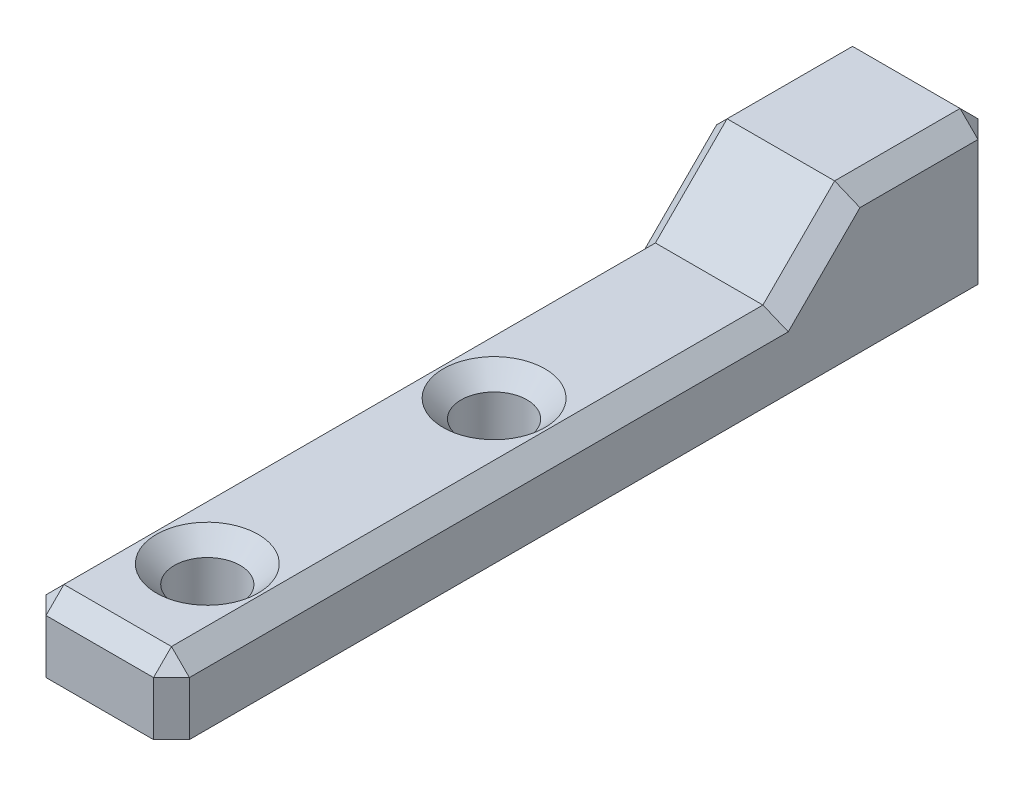
ISO-10303-21;
HEADER;
FILE_DESCRIPTION(('STEP AP214'),'2;1');
FILE_NAME('part.step','',(''),(''),'','','');
FILE_SCHEMA(('AUTOMOTIVE_DESIGN { 1 0 10303 214 1 1 1 1 }'));
ENDSEC;
DATA;
#1=APPLICATION_CONTEXT('core data for automotive mechanical design processes');
#2=APPLICATION_PROTOCOL_DEFINITION('international standard','automotive_design',2000,#1);
#3=PRODUCT_CONTEXT('',#1,'mechanical');
#4=PRODUCT('Part','Part','',(#3));
#5=PRODUCT_RELATED_PRODUCT_CATEGORY('part','',(#4));
#6=PRODUCT_DEFINITION_FORMATION('','',#4);
#7=PRODUCT_DEFINITION_CONTEXT('part definition',#1,'design');
#8=PRODUCT_DEFINITION('design','',#6,#7);
#9=PRODUCT_DEFINITION_SHAPE('','',#8);
#10=(LENGTH_UNIT() NAMED_UNIT(*) SI_UNIT(.MILLI.,.METRE.));
#11=(NAMED_UNIT(*) PLANE_ANGLE_UNIT() SI_UNIT($,.RADIAN.));
#12=(NAMED_UNIT(*) SI_UNIT($,.STERADIAN.) SOLID_ANGLE_UNIT());
#13=UNCERTAINTY_MEASURE_WITH_UNIT(LENGTH_MEASURE(1.E-05),#10,'distance_accuracy_value','');
#14=(GEOMETRIC_REPRESENTATION_CONTEXT(3) GLOBAL_UNCERTAINTY_ASSIGNED_CONTEXT((#13)) GLOBAL_UNIT_ASSIGNED_CONTEXT((#10,
#11,#12)) REPRESENTATION_CONTEXT('',''));
#15=CARTESIAN_POINT('',(0.,0.,0.));
#16=DIRECTION('',(0.,0.,1.));
#17=DIRECTION('',(1.,0.,0.));
#18=AXIS2_PLACEMENT_3D('',#15,#16,#17);
#19=CARTESIAN_POINT('',(0.,12.7,0.));
#20=DIRECTION('',(0.,-1.,0.));
#21=DIRECTION('',(0.,0.,-1.));
#22=AXIS2_PLACEMENT_3D('',#19,#20,#21);
#23=PLANE('',#22);
#24=DIRECTION('',(-1.,0.,0.));
#25=VECTOR('',#24,1.);
#26=CARTESIAN_POINT('',(0.,12.7,-71.4375));
#27=LINE('',#26,#25);
#28=CARTESIAN_POINT('',(11.1125,12.7,-71.4375));
#29=VERTEX_POINT('',#28);
#30=CARTESIAN_POINT('',(1.58750000000001,12.7,-71.4375));
#31=VERTEX_POINT('',#30);
#32=EDGE_CURVE('E251',#29,#31,#27,.T.);
#33=ORIENTED_EDGE('',*,*,#32,.T.);
#34=DIRECTION('',(0.,0.,1.));
#35=VECTOR('',#34,1.);
#36=CARTESIAN_POINT('',(1.58750000000001,12.7,0.));
#37=LINE('',#36,#35);
#38=CARTESIAN_POINT('',(1.58750000000001,12.7,-60.325));
#39=VERTEX_POINT('',#38);
#40=EDGE_CURVE('E254',#31,#39,#37,.T.);
#41=ORIENTED_EDGE('',*,*,#40,.T.);
#42=DIRECTION('',(1.,0.,0.));
#43=VECTOR('',#42,1.);
#44=CARTESIAN_POINT('',(0.,12.7,-60.325));
#45=LINE('',#44,#43);
#46=CARTESIAN_POINT('',(11.1125,12.7,-60.325));
#47=VERTEX_POINT('',#46);
#48=EDGE_CURVE('E338',#39,#47,#45,.T.);
#49=ORIENTED_EDGE('',*,*,#48,.T.);
#50=DIRECTION('',(0.,0.,-1.));
#51=VECTOR('',#50,1.);
#52=CARTESIAN_POINT('',(11.1125,12.7,0.));
#53=LINE('',#52,#51);
#54=EDGE_CURVE('E248',#47,#29,#53,.T.);
#55=ORIENTED_EDGE('',*,*,#54,.T.);
#56=EDGE_LOOP('',(#33,#41,#49,#55));
#57=FACE_BOUND('',#56,.T.);
#58=ADVANCED_FACE('F41',(#57),#23,.F.);
#59=CARTESIAN_POINT('',(0.,0.,0.));
#60=DIRECTION('',(0.,-1.,0.));
#61=DIRECTION('',(0.,0.,-1.));
#62=AXIS2_PLACEMENT_3D('',#59,#60,#61);
#63=PLANE('',#62);
#64=CARTESIAN_POINT('',(6.35,0.,-9.525));
#65=DIRECTION('',(0.,1.,0.));
#66=DIRECTION('',(0.,0.,1.));
#67=AXIS2_PLACEMENT_3D('',#64,#65,#66);
#68=CIRCLE('',#67,2.921);
#69=CARTESIAN_POINT('',(6.35,0.,-6.604));
#70=VERTEX_POINT('',#69);
#71=EDGE_CURVE('E183',#70,#70,#68,.T.);
#72=ORIENTED_EDGE('',*,*,#71,.T.);
#73=EDGE_LOOP('',(#72));
#74=FACE_BOUND('',#73,.T.);
#75=DIRECTION('',(1.,0.,0.));
#76=VECTOR('',#75,1.);
#77=CARTESIAN_POINT('',(0.,0.,0.));
#78=LINE('',#77,#76);
#79=CARTESIAN_POINT('',(1.58750000000001,0.,0.));
#80=VERTEX_POINT('',#79);
#81=CARTESIAN_POINT('',(11.1125,0.,0.));
#82=VERTEX_POINT('',#81);
#83=EDGE_CURVE('E161',#80,#82,#78,.T.);
#84=ORIENTED_EDGE('',*,*,#83,.F.);
#85=DIRECTION('',(0.707106781186548,0.,0.707106781186548));
#86=VECTOR('',#85,1.);
#87=CARTESIAN_POINT('',(0.793750000000006,0.,-0.793750000000006));
#88=LINE('',#87,#86);
#89=CARTESIAN_POINT('',(0.,0.,-1.58750000000001));
#90=VERTEX_POINT('',#89);
#91=EDGE_CURVE('E144',#80,#90,#88,.F.);
#92=ORIENTED_EDGE('',*,*,#91,.T.);
#93=DIRECTION('',(0.,0.,1.));
#94=VECTOR('',#93,1.);
#95=CARTESIAN_POINT('',(0.,0.,0.));
#96=LINE('',#95,#94);
#97=CARTESIAN_POINT('',(0.,0.,-71.4375));
#98=VERTEX_POINT('',#97);
#99=EDGE_CURVE('E176',#98,#90,#96,.T.);
#100=ORIENTED_EDGE('',*,*,#99,.F.);
#101=DIRECTION('',(-0.707106781186549,0.,0.707106781186546));
#102=VECTOR('',#101,1.);
#103=CARTESIAN_POINT('',(-35.71875,0.,-35.7187500000002));
#104=LINE('',#103,#102);
#105=CARTESIAN_POINT('',(1.58750000000001,0.,-73.025));
#106=VERTEX_POINT('',#105);
#107=EDGE_CURVE('E199',#98,#106,#104,.F.);
#108=ORIENTED_EDGE('',*,*,#107,.T.);
#109=DIRECTION('',(-1.,0.,0.));
#110=VECTOR('',#109,1.);
#111=CARTESIAN_POINT('',(0.,0.,-73.025));
#112=LINE('',#111,#110);
#113=CARTESIAN_POINT('',(11.1125,0.,-73.025));
#114=VERTEX_POINT('',#113);
#115=EDGE_CURVE('E181',#114,#106,#112,.T.);
#116=ORIENTED_EDGE('',*,*,#115,.F.);
#117=DIRECTION('',(-0.707106781186549,0.,-0.707106781186546));
#118=VECTOR('',#117,1.);
#119=CARTESIAN_POINT('',(42.06875,0.,-42.0687500000002));
#120=LINE('',#119,#118);
#121=CARTESIAN_POINT('',(12.7,0.,-71.4375));
#122=VERTEX_POINT('',#121);
#123=EDGE_CURVE('E167',#114,#122,#120,.F.);
#124=ORIENTED_EDGE('',*,*,#123,.T.);
#125=DIRECTION('',(0.,0.,-1.));
#126=VECTOR('',#125,1.);
#127=CARTESIAN_POINT('',(12.7,0.,0.));
#128=LINE('',#127,#126);
#129=CARTESIAN_POINT('',(12.7,0.,-1.58750000000001));
#130=VERTEX_POINT('',#129);
#131=EDGE_CURVE('E175',#130,#122,#128,.T.);
#132=ORIENTED_EDGE('',*,*,#131,.F.);
#133=DIRECTION('',(0.707106781186548,0.,-0.707106781186548));
#134=VECTOR('',#133,1.);
#135=CARTESIAN_POINT('',(5.55624999999999,0.,5.55624999999999));
#136=LINE('',#135,#134);
#137=EDGE_CURVE('E156',#130,#82,#136,.F.);
#138=ORIENTED_EDGE('',*,*,#137,.T.);
#139=EDGE_LOOP('',(#84,#92,#100,#108,#116,#124,#132,#138));
#140=FACE_BOUND('',#139,.T.);
#141=CARTESIAN_POINT('',(6.35,0.,-34.925));
#142=DIRECTION('',(0.,1.,0.));
#143=DIRECTION('',(0.,0.,1.));
#144=AXIS2_PLACEMENT_3D('',#141,#142,#143);
#145=CIRCLE('',#144,2.921);
#146=CARTESIAN_POINT('',(6.35,0.,-32.004));
#147=VERTEX_POINT('',#146);
#148=EDGE_CURVE('E344',#147,#147,#145,.T.);
#149=ORIENTED_EDGE('',*,*,#148,.T.);
#150=EDGE_LOOP('',(#149));
#151=FACE_BOUND('',#150,.T.);
#152=ADVANCED_FACE('F170',(#74,#140,#151),#63,.T.);
#153=CARTESIAN_POINT('',(0.,12.7,0.));
#154=DIRECTION('',(1.,0.,0.));
#155=DIRECTION('',(0.,0.,-1.));
#156=AXIS2_PLACEMENT_3D('',#153,#154,#155);
#157=PLANE('',#156);
#158=DIRECTION('',(0.,0.,-1.));
#159=VECTOR('',#158,1.);
#160=CARTESIAN_POINT('',(0.,11.1125,0.));
#161=LINE('',#160,#159);
#162=CARTESIAN_POINT('',(0.,11.1125,-60.9825640302673));
#163=VERTEX_POINT('',#162);
#164=CARTESIAN_POINT('',(0.,11.1125,-71.4375));
#165=VERTEX_POINT('',#164);
#166=EDGE_CURVE('E211',#163,#165,#161,.T.);
#167=ORIENTED_EDGE('',*,*,#166,.T.);
#168=DIRECTION('',(0.,-1.,0.));
#169=VECTOR('',#168,1.);
#170=CARTESIAN_POINT('',(0.,12.7,-71.4375));
#171=LINE('',#170,#169);
#172=EDGE_CURVE('E214',#165,#98,#171,.T.);
#173=ORIENTED_EDGE('',*,*,#172,.T.);
#174=ORIENTED_EDGE('',*,*,#99,.T.);
#175=DIRECTION('',(0.,1.,0.));
#176=VECTOR('',#175,1.);
#177=CARTESIAN_POINT('',(0.,12.7,-1.58750000000001));
#178=LINE('',#177,#176);
#179=CARTESIAN_POINT('',(0.,4.76249999999999,-1.58750000000001));
#180=VERTEX_POINT('',#179);
#181=EDGE_CURVE('E149',#90,#180,#178,.T.);
#182=ORIENTED_EDGE('',*,*,#181,.T.);
#183=DIRECTION('',(0.,0.,-1.));
#184=VECTOR('',#183,1.);
#185=CARTESIAN_POINT('',(0.,4.76249999999999,0.));
#186=LINE('',#185,#184);
#187=CARTESIAN_POINT('',(0.,4.76249999999999,-54.6325640302673));
#188=VERTEX_POINT('',#187);
#189=EDGE_CURVE('E155',#180,#188,#186,.T.);
#190=ORIENTED_EDGE('',*,*,#189,.T.);
#191=DIRECTION('',(0.,0.707106781186549,-0.707106781186546));
#192=VECTOR('',#191,1.);
#193=CARTESIAN_POINT('',(0.,-18.5850320151336,-31.2850320151337));
#194=LINE('',#193,#192);
#195=EDGE_CURVE('E206',#188,#163,#194,.T.);
#196=ORIENTED_EDGE('',*,*,#195,.T.);
#197=EDGE_LOOP('',(#167,#173,#174,#182,#190,#196));
#198=FACE_BOUND('',#197,.T.);
#199=ADVANCED_FACE('F378',(#198),#157,.F.);
#200=CARTESIAN_POINT('',(0.,12.7,0.));
#201=DIRECTION('',(0.,0.,-1.));
#202=DIRECTION('',(-1.,0.,0.));
#203=AXIS2_PLACEMENT_3D('',#200,#201,#202);
#204=PLANE('',#203);
#205=DIRECTION('',(-1.,0.,0.));
#206=VECTOR('',#205,1.);
#207=CARTESIAN_POINT('',(0.,4.76249999999999,0.));
#208=LINE('',#207,#206);
#209=CARTESIAN_POINT('',(11.1125,4.76249999999999,0.));
#210=VERTEX_POINT('',#209);
#211=CARTESIAN_POINT('',(1.58750000000001,4.76249999999999,0.));
#212=VERTEX_POINT('',#211);
#213=EDGE_CURVE('E164',#210,#212,#208,.T.);
#214=ORIENTED_EDGE('',*,*,#213,.T.);
#215=DIRECTION('',(0.,-1.,0.));
#216=VECTOR('',#215,1.);
#217=CARTESIAN_POINT('',(1.58750000000001,12.7,0.));
#218=LINE('',#217,#216);
#219=EDGE_CURVE('E148',#212,#80,#218,.T.);
#220=ORIENTED_EDGE('',*,*,#219,.T.);
#221=ORIENTED_EDGE('',*,*,#83,.T.);
#222=DIRECTION('',(0.,1.,0.));
#223=VECTOR('',#222,1.);
#224=CARTESIAN_POINT('',(11.1125,12.7,0.));
#225=LINE('',#224,#223);
#226=EDGE_CURVE('E168',#82,#210,#225,.T.);
#227=ORIENTED_EDGE('',*,*,#226,.T.);
#228=EDGE_LOOP('',(#214,#220,#221,#227));
#229=FACE_BOUND('',#228,.T.);
#230=ADVANCED_FACE('F160',(#229),#204,.F.);
#231=CARTESIAN_POINT('',(12.7,12.7,0.));
#232=DIRECTION('',(-1.,0.,0.));
#233=DIRECTION('',(0.,0.,1.));
#234=AXIS2_PLACEMENT_3D('',#231,#232,#233);
#235=PLANE('',#234);
#236=DIRECTION('',(0.,0.,1.));
#237=VECTOR('',#236,1.);
#238=CARTESIAN_POINT('',(12.7,4.76249999999999,0.));
#239=LINE('',#238,#237);
#240=CARTESIAN_POINT('',(12.7,4.76249999999999,-54.6325640302673));
#241=VERTEX_POINT('',#240);
#242=CARTESIAN_POINT('',(12.7,4.76249999999999,-1.58750000000001));
#243=VERTEX_POINT('',#242);
#244=EDGE_CURVE('E217',#241,#243,#239,.T.);
#245=ORIENTED_EDGE('',*,*,#244,.T.);
#246=DIRECTION('',(0.,-1.,0.));
#247=VECTOR('',#246,1.);
#248=CARTESIAN_POINT('',(12.7,12.7,-1.58750000000001));
#249=LINE('',#248,#247);
#250=EDGE_CURVE('E229',#243,#130,#249,.T.);
#251=ORIENTED_EDGE('',*,*,#250,.T.);
#252=ORIENTED_EDGE('',*,*,#131,.T.);
#253=DIRECTION('',(0.,1.,0.));
#254=VECTOR('',#253,1.);
#255=CARTESIAN_POINT('',(12.7,12.7,-71.4375));
#256=LINE('',#255,#254);
#257=CARTESIAN_POINT('',(12.7,11.1125,-71.4375));
#258=VERTEX_POINT('',#257);
#259=EDGE_CURVE('E226',#122,#258,#256,.T.);
#260=ORIENTED_EDGE('',*,*,#259,.T.);
#261=DIRECTION('',(0.,0.,1.));
#262=VECTOR('',#261,1.);
#263=CARTESIAN_POINT('',(12.7,11.1125,0.));
#264=LINE('',#263,#262);
#265=CARTESIAN_POINT('',(12.7,11.1125,-60.9825640302673));
#266=VERTEX_POINT('',#265);
#267=EDGE_CURVE('E223',#258,#266,#264,.T.);
#268=ORIENTED_EDGE('',*,*,#267,.T.);
#269=DIRECTION('',(0.,-0.707106781186549,0.707106781186546));
#270=VECTOR('',#269,1.);
#271=CARTESIAN_POINT('',(12.7,-18.5850320151336,-31.2850320151337));
#272=LINE('',#271,#270);
#273=EDGE_CURVE('E220',#266,#241,#272,.T.);
#274=ORIENTED_EDGE('',*,*,#273,.T.);
#275=EDGE_LOOP('',(#245,#251,#252,#260,#268,#274));
#276=FACE_BOUND('',#275,.T.);
#277=ADVANCED_FACE('F370',(#276),#235,.F.);
#278=CARTESIAN_POINT('',(0.,12.7,-73.025));
#279=DIRECTION('',(0.,0.,1.));
#280=DIRECTION('',(1.,0.,0.));
#281=AXIS2_PLACEMENT_3D('',#278,#279,#280);
#282=PLANE('',#281);
#283=ORIENTED_EDGE('',*,*,#115,.T.);
#284=DIRECTION('',(0.,1.,0.));
#285=VECTOR('',#284,1.);
#286=CARTESIAN_POINT('',(1.58750000000001,12.7,-73.025));
#287=LINE('',#286,#285);
#288=CARTESIAN_POINT('',(1.58750000000001,11.1125,-73.025));
#289=VERTEX_POINT('',#288);
#290=EDGE_CURVE('E238',#106,#289,#287,.T.);
#291=ORIENTED_EDGE('',*,*,#290,.T.);
#292=DIRECTION('',(1.,0.,0.));
#293=VECTOR('',#292,1.);
#294=CARTESIAN_POINT('',(0.,11.1125,-73.025));
#295=LINE('',#294,#293);
#296=CARTESIAN_POINT('',(11.1125,11.1125,-73.025));
#297=VERTEX_POINT('',#296);
#298=EDGE_CURVE('E232',#289,#297,#295,.T.);
#299=ORIENTED_EDGE('',*,*,#298,.T.);
#300=DIRECTION('',(0.,-1.,0.));
#301=VECTOR('',#300,1.);
#302=CARTESIAN_POINT('',(11.1125,12.7,-73.025));
#303=LINE('',#302,#301);
#304=EDGE_CURVE('E235',#297,#114,#303,.T.);
#305=ORIENTED_EDGE('',*,*,#304,.T.);
#306=EDGE_LOOP('',(#283,#291,#299,#305));
#307=FACE_BOUND('',#306,.T.);
#308=ADVANCED_FACE('F360',(#307),#282,.F.);
#309=CARTESIAN_POINT('',(6.35,12.7,-9.525));
#310=DIRECTION('',(0.,-1.,0.));
#311=DIRECTION('',(0.,0.,-1.));
#312=AXIS2_PLACEMENT_3D('',#309,#310,#311);
#313=CYLINDRICAL_SURFACE('',#312,2.921);
#314=CARTESIAN_POINT('',(6.35,4.76249999999999,-9.525));
#315=DIRECTION('',(0.,-1.,0.));
#316=DIRECTION('',(0.,0.,-1.));
#317=AXIS2_PLACEMENT_3D('',#314,#315,#316);
#318=CIRCLE('',#317,2.921);
#319=CARTESIAN_POINT('',(6.35,4.76249999999999,-12.446));
#320=VERTEX_POINT('',#319);
#321=EDGE_CURVE('E52',#320,#320,#318,.F.);
#322=ORIENTED_EDGE('',*,*,#321,.T.);
#323=EDGE_LOOP('',(#322));
#324=FACE_BOUND('',#323,.T.);
#325=ORIENTED_EDGE('',*,*,#71,.F.);
#326=EDGE_LOOP('',(#325));
#327=FACE_BOUND('',#326,.T.);
#328=ADVANCED_FACE('F357',(#324,#327),#313,.F.);
#329=CARTESIAN_POINT('',(6.35,12.7,-34.925));
#330=DIRECTION('',(0.,-1.,0.));
#331=DIRECTION('',(0.,0.,-1.));
#332=AXIS2_PLACEMENT_3D('',#329,#330,#331);
#333=CYLINDRICAL_SURFACE('',#332,2.921);
#334=CARTESIAN_POINT('',(6.35,4.76249999999999,-34.925));
#335=DIRECTION('',(0.,-1.,0.));
#336=DIRECTION('',(0.,0.,-1.));
#337=AXIS2_PLACEMENT_3D('',#334,#335,#336);
#338=CIRCLE('',#337,2.921);
#339=CARTESIAN_POINT('',(6.35,4.76249999999999,-37.846));
#340=VERTEX_POINT('',#339);
#341=EDGE_CURVE('E11',#340,#340,#338,.F.);
#342=ORIENTED_EDGE('',*,*,#341,.T.);
#343=EDGE_LOOP('',(#342));
#344=FACE_BOUND('',#343,.T.);
#345=ORIENTED_EDGE('',*,*,#148,.F.);
#346=EDGE_LOOP('',(#345));
#347=FACE_BOUND('',#346,.T.);
#348=ADVANCED_FACE('F359',(#344,#347),#333,.F.);
#349=CARTESIAN_POINT('',(0.,6.35,0.));
#350=DIRECTION('',(0.,-1.,0.));
#351=DIRECTION('',(0.,0.,-1.));
#352=AXIS2_PLACEMENT_3D('',#349,#350,#351);
#353=PLANE('',#352);
#354=CARTESIAN_POINT('',(6.35,6.35,-9.525));
#355=DIRECTION('',(0.,-1.,0.));
#356=DIRECTION('',(0.,0.,-1.));
#357=AXIS2_PLACEMENT_3D('',#354,#355,#356);
#358=CIRCLE('',#357,4.50850000000001);
#359=CARTESIAN_POINT('',(6.35,6.35,-14.0335));
#360=VERTEX_POINT('',#359);
#361=EDGE_CURVE('E261',#360,#360,#358,.T.);
#362=ORIENTED_EDGE('',*,*,#361,.T.);
#363=EDGE_LOOP('',(#362));
#364=FACE_BOUND('',#363,.T.);
#365=CARTESIAN_POINT('',(6.35,6.35,-34.925));
#366=DIRECTION('',(0.,-1.,0.));
#367=DIRECTION('',(0.,0.,-1.));
#368=AXIS2_PLACEMENT_3D('',#365,#366,#367);
#369=CIRCLE('',#368,4.50850000000001);
#370=CARTESIAN_POINT('',(6.35,6.35,-39.4335));
#371=VERTEX_POINT('',#370);
#372=EDGE_CURVE('E257',#371,#371,#369,.T.);
#373=ORIENTED_EDGE('',*,*,#372,.T.);
#374=EDGE_LOOP('',(#373));
#375=FACE_BOUND('',#374,.T.);
#376=DIRECTION('',(-1.,0.,0.));
#377=VECTOR('',#376,1.);
#378=CARTESIAN_POINT('',(0.,6.35,-53.975));
#379=LINE('',#378,#377);
#380=CARTESIAN_POINT('',(11.1125,6.35,-53.975));
#381=VERTEX_POINT('',#380);
#382=CARTESIAN_POINT('',(1.58750000000001,6.35,-53.975));
#383=VERTEX_POINT('',#382);
#384=EDGE_CURVE('E190',#381,#383,#379,.T.);
#385=ORIENTED_EDGE('',*,*,#384,.T.);
#386=DIRECTION('',(0.,0.,1.));
#387=VECTOR('',#386,1.);
#388=CARTESIAN_POINT('',(1.58750000000001,6.35,0.));
#389=LINE('',#388,#387);
#390=CARTESIAN_POINT('',(1.58750000000001,6.35,-1.58750000000001));
#391=VERTEX_POINT('',#390);
#392=EDGE_CURVE('E60',#383,#391,#389,.T.);
#393=ORIENTED_EDGE('',*,*,#392,.T.);
#394=DIRECTION('',(1.,0.,0.));
#395=VECTOR('',#394,1.);
#396=CARTESIAN_POINT('',(0.,6.35,-1.58750000000001));
#397=LINE('',#396,#395);
#398=CARTESIAN_POINT('',(11.1125,6.35,-1.58750000000001));
#399=VERTEX_POINT('',#398);
#400=EDGE_CURVE('E64',#391,#399,#397,.T.);
#401=ORIENTED_EDGE('',*,*,#400,.T.);
#402=DIRECTION('',(0.,0.,-1.));
#403=VECTOR('',#402,1.);
#404=CARTESIAN_POINT('',(11.1125,6.35,0.));
#405=LINE('',#404,#403);
#406=EDGE_CURVE('E265',#399,#381,#405,.T.);
#407=ORIENTED_EDGE('',*,*,#406,.T.);
#408=EDGE_LOOP('',(#385,#393,#401,#407));
#409=FACE_BOUND('',#408,.T.);
#410=ADVANCED_FACE('F367',(#364,#375,#409),#353,.F.);
#411=CARTESIAN_POINT('',(0.,12.7,-60.325));
#412=DIRECTION('',(0.,0.707106781186546,0.707106781186549));
#413=DIRECTION('',(-1.,0.,0.));
#414=AXIS2_PLACEMENT_3D('',#411,#412,#413);
#415=PLANE('',#414);
#416=ORIENTED_EDGE('',*,*,#48,.F.);
#417=DIRECTION('',(0.,0.707106781186549,-0.707106781186546));
#418=VECTOR('',#417,1.);
#419=CARTESIAN_POINT('',(1.58750000000001,12.7,-60.325));
#420=LINE('',#419,#418);
#421=EDGE_CURVE('E244',#39,#383,#420,.F.);
#422=ORIENTED_EDGE('',*,*,#421,.T.);
#423=ORIENTED_EDGE('',*,*,#384,.F.);
#424=DIRECTION('',(0.,-0.707106781186549,0.707106781186546));
#425=VECTOR('',#424,1.);
#426=CARTESIAN_POINT('',(11.1125,12.7,-60.325));
#427=LINE('',#426,#425);
#428=EDGE_CURVE('E241',#381,#47,#427,.F.);
#429=ORIENTED_EDGE('',*,*,#428,.T.);
#430=EDGE_LOOP('',(#416,#422,#423,#429));
#431=FACE_BOUND('',#430,.T.);
#432=ADVANCED_FACE('F390',(#431),#415,.T.);
#433=CARTESIAN_POINT('',(11.1125,12.7,-73.025));
#434=DIRECTION('',(-0.707106781186546,0.,0.707106781186549));
#435=DIRECTION('',(0.,-1.,0.));
#436=AXIS2_PLACEMENT_3D('',#433,#434,#435);
#437=PLANE('',#436);
#438=DIRECTION('',(0.707106781186549,0.,0.707106781186546));
#439=VECTOR('',#438,1.);
#440=CARTESIAN_POINT('',(12.7,11.1125,-71.4375));
#441=LINE('',#440,#439);
#442=EDGE_CURVE('E46',#258,#297,#441,.F.);
#443=ORIENTED_EDGE('',*,*,#442,.F.);
#444=ORIENTED_EDGE('',*,*,#259,.F.);
#445=ORIENTED_EDGE('',*,*,#123,.F.);
#446=ORIENTED_EDGE('',*,*,#304,.F.);
#447=EDGE_LOOP('',(#443,#444,#445,#446));
#448=FACE_BOUND('',#447,.T.);
#449=ADVANCED_FACE('F396',(#448),#437,.F.);
#450=CARTESIAN_POINT('',(12.7,11.1125,-71.4375));
#451=DIRECTION('',(0.577350269189625,0.577350269189625,-0.577350269189627));
#452=DIRECTION('',(-0.707106781186549,0.,-0.707106781186546));
#453=AXIS2_PLACEMENT_3D('',#450,#451,#452);
#454=PLANE('',#453);
#455=DIRECTION('',(-0.707106781186548,0.707106781186548,0.));
#456=VECTOR('',#455,1.);
#457=CARTESIAN_POINT('',(12.7,11.1125,-71.4375));
#458=LINE('',#457,#456);
#459=EDGE_CURVE('E326',#258,#29,#458,.T.);
#460=ORIENTED_EDGE('',*,*,#459,.F.);
#461=ORIENTED_EDGE('',*,*,#442,.T.);
#462=DIRECTION('',(0.,-0.707106781186549,-0.707106781186546));
#463=VECTOR('',#462,1.);
#464=CARTESIAN_POINT('',(11.1125,11.90625,-72.23125));
#465=LINE('',#464,#463);
#466=EDGE_CURVE('E329',#29,#297,#465,.T.);
#467=ORIENTED_EDGE('',*,*,#466,.F.);
#468=EDGE_LOOP('',(#460,#461,#467));
#469=FACE_BOUND('',#468,.T.);
#470=ADVANCED_FACE('F495',(#469),#454,.T.);
#471=CARTESIAN_POINT('',(0.,12.7,-71.4375));
#472=DIRECTION('',(0.707106781186546,0.,0.707106781186549));
#473=DIRECTION('',(0.,-1.,0.));
#474=AXIS2_PLACEMENT_3D('',#471,#472,#473);
#475=PLANE('',#474);
#476=ORIENTED_EDGE('',*,*,#107,.F.);
#477=ORIENTED_EDGE('',*,*,#172,.F.);
#478=DIRECTION('',(0.707106781186549,0.,-0.707106781186546));
#479=VECTOR('',#478,1.);
#480=CARTESIAN_POINT('',(1.58750000000001,11.1125,-73.025));
#481=LINE('',#480,#479);
#482=EDGE_CURVE('E322',#289,#165,#481,.F.);
#483=ORIENTED_EDGE('',*,*,#482,.F.);
#484=ORIENTED_EDGE('',*,*,#290,.F.);
#485=EDGE_LOOP('',(#476,#477,#483,#484));
#486=FACE_BOUND('',#485,.T.);
#487=ADVANCED_FACE('F489',(#486),#475,.F.);
#488=CARTESIAN_POINT('',(0.,12.7,-71.4375));
#489=DIRECTION('',(0.,-0.707106781186546,0.707106781186549));
#490=DIRECTION('',(-1.,0.,0.));
#491=AXIS2_PLACEMENT_3D('',#488,#489,#490);
#492=PLANE('',#491);
#493=ORIENTED_EDGE('',*,*,#466,.T.);
#494=ORIENTED_EDGE('',*,*,#298,.F.);
#495=DIRECTION('',(0.,0.707106781186549,0.707106781186546));
#496=VECTOR('',#495,1.);
#497=CARTESIAN_POINT('',(1.58750000000001,11.1125,-73.025));
#498=LINE('',#497,#496);
#499=EDGE_CURVE('E318',#31,#289,#498,.F.);
#500=ORIENTED_EDGE('',*,*,#499,.F.);
#501=ORIENTED_EDGE('',*,*,#32,.F.);
#502=EDGE_LOOP('',(#493,#494,#500,#501));
#503=FACE_BOUND('',#502,.T.);
#504=ADVANCED_FACE('F482',(#503),#492,.F.);
#505=CARTESIAN_POINT('',(11.1125,12.7,0.));
#506=DIRECTION('',(-0.707106781186547,-0.707106781186547,0.));
#507=DIRECTION('',(0.,0.,-1.));
#508=AXIS2_PLACEMENT_3D('',#505,#506,#507);
#509=PLANE('',#508);
#510=ORIENTED_EDGE('',*,*,#459,.T.);
#511=ORIENTED_EDGE('',*,*,#54,.F.);
#512=DIRECTION('',(0.678598344545848,-0.678598344545848,-0.281084637714817));
#513=VECTOR('',#512,1.);
#514=CARTESIAN_POINT('',(20.7109729144701,3.10152708552984,-64.3008176592443));
#515=LINE('',#514,#513);
#516=EDGE_CURVE('E314',#266,#47,#515,.F.);
#517=ORIENTED_EDGE('',*,*,#516,.F.);
#518=ORIENTED_EDGE('',*,*,#267,.F.);
#519=EDGE_LOOP('',(#510,#511,#517,#518));
#520=FACE_BOUND('',#519,.T.);
#521=ADVANCED_FACE('F475',(#520),#509,.F.);
#522=CARTESIAN_POINT('',(1.58750000000001,11.1125,-73.025));
#523=DIRECTION('',(-0.577350269189625,0.577350269189625,-0.577350269189628));
#524=DIRECTION('',(-0.707106781186549,0.,0.707106781186546));
#525=AXIS2_PLACEMENT_3D('',#522,#523,#524);
#526=PLANE('',#525);
#527=ORIENTED_EDGE('',*,*,#499,.T.);
#528=ORIENTED_EDGE('',*,*,#482,.T.);
#529=DIRECTION('',(-0.707106781186547,-0.707106781186547,0.));
#530=VECTOR('',#529,1.);
#531=CARTESIAN_POINT('',(0.793750000000006,11.90625,-71.4375));
#532=LINE('',#531,#530);
#533=EDGE_CURVE('E310',#31,#165,#532,.T.);
#534=ORIENTED_EDGE('',*,*,#533,.F.);
#535=EDGE_LOOP('',(#527,#528,#534));
#536=FACE_BOUND('',#535,.T.);
#537=ADVANCED_FACE('F468',(#536),#526,.T.);
#538=CARTESIAN_POINT('',(12.7,-18.5850320151336,-31.2850320151337));
#539=DIRECTION('',(0.707106781186546,0.5,0.500000000000002));
#540=DIRECTION('',(0.,0.707106781186549,-0.707106781186546));
#541=AXIS2_PLACEMENT_3D('',#538,#539,#540);
#542=PLANE('',#541);
#543=ORIENTED_EDGE('',*,*,#516,.T.);
#544=ORIENTED_EDGE('',*,*,#428,.F.);
#545=DIRECTION('',(0.678598344545848,-0.678598344545848,-0.281084637714817));
#546=VECTOR('',#545,1.);
#547=CARTESIAN_POINT('',(18.9980468039448,-1.53554680394479,-57.2413004329217));
#548=LINE('',#547,#546);
#549=EDGE_CURVE('E306',#241,#381,#548,.F.);
#550=ORIENTED_EDGE('',*,*,#549,.F.);
#551=ORIENTED_EDGE('',*,*,#273,.F.);
#552=EDGE_LOOP('',(#543,#544,#550,#551));
#553=FACE_BOUND('',#552,.T.);
#554=ADVANCED_FACE('F461',(#553),#542,.T.);
#555=CARTESIAN_POINT('',(1.58750000000001,12.7,0.));
#556=DIRECTION('',(0.707106781186547,-0.707106781186547,0.));
#557=DIRECTION('',(0.,0.,1.));
#558=AXIS2_PLACEMENT_3D('',#555,#556,#557);
#559=PLANE('',#558);
#560=ORIENTED_EDGE('',*,*,#533,.T.);
#561=ORIENTED_EDGE('',*,*,#166,.F.);
#562=DIRECTION('',(-0.678598344545848,-0.678598344545848,-0.281084637714817));
#563=VECTOR('',#562,1.);
#564=CARTESIAN_POINT('',(13.0941058500276,24.2066058500276,-55.558807800037));
#565=LINE('',#564,#563);
#566=EDGE_CURVE('E302',#39,#163,#565,.T.);
#567=ORIENTED_EDGE('',*,*,#566,.F.);
#568=ORIENTED_EDGE('',*,*,#40,.F.);
#569=EDGE_LOOP('',(#560,#561,#567,#568));
#570=FACE_BOUND('',#569,.T.);
#571=ADVANCED_FACE('F454',(#570),#559,.F.);
#572=CARTESIAN_POINT('',(11.1125,6.35,0.));
#573=DIRECTION('',(-0.707106781186547,-0.707106781186547,0.));
#574=DIRECTION('',(0.,0.,-1.));
#575=AXIS2_PLACEMENT_3D('',#572,#573,#574);
#576=PLANE('',#575);
#577=ORIENTED_EDGE('',*,*,#549,.T.);
#578=ORIENTED_EDGE('',*,*,#406,.F.);
#579=DIRECTION('',(0.707106781186547,-0.707106781186547,0.));
#580=VECTOR('',#579,1.);
#581=CARTESIAN_POINT('',(11.90625,5.55624999999999,-1.58750000000001));
#582=LINE('',#581,#580);
#583=EDGE_CURVE('E298',#243,#399,#582,.F.);
#584=ORIENTED_EDGE('',*,*,#583,.F.);
#585=ORIENTED_EDGE('',*,*,#244,.F.);
#586=EDGE_LOOP('',(#577,#578,#584,#585));
#587=FACE_BOUND('',#586,.T.);
#588=ADVANCED_FACE('F447',(#587),#576,.F.);
#589=CARTESIAN_POINT('',(12.7,12.7,-1.58750000000001));
#590=DIRECTION('',(-0.707106781186547,0.,-0.707106781186547));
#591=DIRECTION('',(0.,-1.,0.));
#592=AXIS2_PLACEMENT_3D('',#589,#590,#591);
#593=PLANE('',#592);
#594=ORIENTED_EDGE('',*,*,#137,.F.);
#595=ORIENTED_EDGE('',*,*,#250,.F.);
#596=DIRECTION('',(-0.707106781186547,0.,0.707106781186547));
#597=VECTOR('',#596,1.);
#598=CARTESIAN_POINT('',(11.1125,4.76249999999999,0.));
#599=LINE('',#598,#597);
#600=EDGE_CURVE('E294',#210,#243,#599,.F.);
#601=ORIENTED_EDGE('',*,*,#600,.F.);
#602=ORIENTED_EDGE('',*,*,#226,.F.);
#603=EDGE_LOOP('',(#594,#595,#601,#602));
#604=FACE_BOUND('',#603,.T.);
#605=ADVANCED_FACE('F440',(#604),#593,.F.);
#606=CARTESIAN_POINT('',(0.,-18.5850320151336,-31.2850320151337));
#607=DIRECTION('',(-0.707106781186546,0.5,0.500000000000002));
#608=DIRECTION('',(0.,-0.707106781186549,0.707106781186546));
#609=AXIS2_PLACEMENT_3D('',#606,#607,#608);
#610=PLANE('',#609);
#611=ORIENTED_EDGE('',*,*,#566,.T.);
#612=ORIENTED_EDGE('',*,*,#195,.F.);
#613=DIRECTION('',(0.678598344545848,0.678598344545848,0.281084637714817));
#614=VECTOR('',#613,1.);
#615=CARTESIAN_POINT('',(-6.29804680394477,-1.53554680394479,-57.2413004329217));
#616=LINE('',#615,#614);
#617=EDGE_CURVE('E290',#383,#188,#616,.F.);
#618=ORIENTED_EDGE('',*,*,#617,.F.);
#619=ORIENTED_EDGE('',*,*,#421,.F.);
#620=EDGE_LOOP('',(#611,#612,#618,#619));
#621=FACE_BOUND('',#620,.T.);
#622=ADVANCED_FACE('F433',(#621),#610,.T.);
#623=CARTESIAN_POINT('',(11.1125,4.76249999999999,0.));
#624=DIRECTION('',(0.577350269189626,0.577350269189626,0.577350269189626));
#625=DIRECTION('',(0.707106781186547,0.,-0.707106781186547));
#626=AXIS2_PLACEMENT_3D('',#623,#624,#625);
#627=PLANE('',#626);
#628=ORIENTED_EDGE('',*,*,#600,.T.);
#629=ORIENTED_EDGE('',*,*,#583,.T.);
#630=DIRECTION('',(0.,0.707106781186547,-0.707106781186547));
#631=VECTOR('',#630,1.);
#632=CARTESIAN_POINT('',(11.1125,4.76249999999999,0.));
#633=LINE('',#632,#631);
#634=EDGE_CURVE('E286',#210,#399,#633,.T.);
#635=ORIENTED_EDGE('',*,*,#634,.F.);
#636=EDGE_LOOP('',(#628,#629,#635));
#637=FACE_BOUND('',#636,.T.);
#638=ADVANCED_FACE('F426',(#637),#627,.T.);
#639=CARTESIAN_POINT('',(0.,4.76249999999999,0.));
#640=DIRECTION('',(0.707106781186547,-0.707106781186547,0.));
#641=DIRECTION('',(0.,0.,-1.));
#642=AXIS2_PLACEMENT_3D('',#639,#640,#641);
#643=PLANE('',#642);
#644=ORIENTED_EDGE('',*,*,#617,.T.);
#645=ORIENTED_EDGE('',*,*,#189,.F.);
#646=DIRECTION('',(0.707106781186547,0.707106781186547,0.));
#647=VECTOR('',#646,1.);
#648=CARTESIAN_POINT('',(0.,4.76249999999999,-1.58750000000001));
#649=LINE('',#648,#647);
#650=EDGE_CURVE('E282',#391,#180,#649,.F.);
#651=ORIENTED_EDGE('',*,*,#650,.F.);
#652=ORIENTED_EDGE('',*,*,#392,.F.);
#653=EDGE_LOOP('',(#644,#645,#651,#652));
#654=FACE_BOUND('',#653,.T.);
#655=ADVANCED_FACE('F419',(#654),#643,.F.);
#656=CARTESIAN_POINT('',(0.,6.35,-1.58750000000001));
#657=DIRECTION('',(0.,-0.707106781186547,-0.707106781186547));
#658=DIRECTION('',(1.,0.,0.));
#659=AXIS2_PLACEMENT_3D('',#656,#657,#658);
#660=PLANE('',#659);
#661=ORIENTED_EDGE('',*,*,#634,.T.);
#662=ORIENTED_EDGE('',*,*,#400,.F.);
#663=DIRECTION('',(0.,-0.707106781186547,0.707106781186547));
#664=VECTOR('',#663,1.);
#665=CARTESIAN_POINT('',(1.58750000000001,5.55624999999999,-0.793750000000006));
#666=LINE('',#665,#664);
#667=EDGE_CURVE('E278',#212,#391,#666,.F.);
#668=ORIENTED_EDGE('',*,*,#667,.F.);
#669=ORIENTED_EDGE('',*,*,#213,.F.);
#670=EDGE_LOOP('',(#661,#662,#668,#669));
#671=FACE_BOUND('',#670,.T.);
#672=ADVANCED_FACE('F412',(#671),#660,.F.);
#673=CARTESIAN_POINT('',(0.,4.76249999999999,-1.58750000000001));
#674=DIRECTION('',(-0.577350269189626,0.577350269189626,0.577350269189626));
#675=DIRECTION('',(0.707106781186547,0.,0.707106781186547));
#676=AXIS2_PLACEMENT_3D('',#673,#674,#675);
#677=PLANE('',#676);
#678=ORIENTED_EDGE('',*,*,#667,.T.);
#679=ORIENTED_EDGE('',*,*,#650,.T.);
#680=DIRECTION('',(-0.707106781186547,0.,-0.707106781186547));
#681=VECTOR('',#680,1.);
#682=CARTESIAN_POINT('',(0.,4.76249999999999,-1.58750000000001));
#683=LINE('',#682,#681);
#684=EDGE_CURVE('E275',#212,#180,#683,.T.);
#685=ORIENTED_EDGE('',*,*,#684,.F.);
#686=EDGE_LOOP('',(#678,#679,#685));
#687=FACE_BOUND('',#686,.T.);
#688=ADVANCED_FACE('F406',(#687),#677,.T.);
#689=CARTESIAN_POINT('',(1.58750000000001,12.7,0.));
#690=DIRECTION('',(0.707106781186547,0.,-0.707106781186547));
#691=DIRECTION('',(0.,-1.,0.));
#692=AXIS2_PLACEMENT_3D('',#689,#690,#691);
#693=PLANE('',#692);
#694=ORIENTED_EDGE('',*,*,#684,.T.);
#695=ORIENTED_EDGE('',*,*,#181,.F.);
#696=ORIENTED_EDGE('',*,*,#91,.F.);
#697=ORIENTED_EDGE('',*,*,#219,.F.);
#698=EDGE_LOOP('',(#694,#695,#696,#697));
#699=FACE_BOUND('',#698,.T.);
#700=ADVANCED_FACE('F147',(#699),#693,.F.);
#701=CARTESIAN_POINT('',(6.35,6.35,-9.525));
#702=DIRECTION('',(0.,1.,0.));
#703=DIRECTION('',(0.,0.,1.));
#704=AXIS2_PLACEMENT_3D('',#701,#702,#703);
#705=CONICAL_SURFACE('',#704,4.50850000000001,0.785398163397449);
#706=ORIENTED_EDGE('',*,*,#321,.F.);
#707=EDGE_LOOP('',(#706));
#708=FACE_BOUND('',#707,.T.);
#709=ORIENTED_EDGE('',*,*,#361,.F.);
#710=EDGE_LOOP('',(#709));
#711=FACE_BOUND('',#710,.T.);
#712=ADVANCED_FACE('F405',(#708,#711),#705,.F.);
#713=CARTESIAN_POINT('',(6.35,6.35,-34.925));
#714=DIRECTION('',(0.,1.,0.));
#715=DIRECTION('',(0.,0.,1.));
#716=AXIS2_PLACEMENT_3D('',#713,#714,#715);
#717=CONICAL_SURFACE('',#716,4.50850000000001,0.785398163397445);
#718=ORIENTED_EDGE('',*,*,#341,.F.);
#719=EDGE_LOOP('',(#718));
#720=FACE_BOUND('',#719,.T.);
#721=ORIENTED_EDGE('',*,*,#372,.F.);
#722=EDGE_LOOP('',(#721));
#723=FACE_BOUND('',#722,.T.);
#724=ADVANCED_FACE('F44',(#720,#723),#717,.F.);
#725=CLOSED_SHELL('',(#58,#152,#199,#230,#277,#308,#328,#348,#410,#432,#449,#470,#487,#504,#521,
#537,#554,#571,#588,#605,#622,#638,#655,#672,#688,#700,#712,#724));
#726=MANIFOLD_SOLID_BREP('B2',#725);
#727=ADVANCED_BREP_SHAPE_REPRESENTATION('',(#18,#726),#14);
#728=SHAPE_DEFINITION_REPRESENTATION(#9,#727);
ENDSEC;
END-ISO-10303-21;
